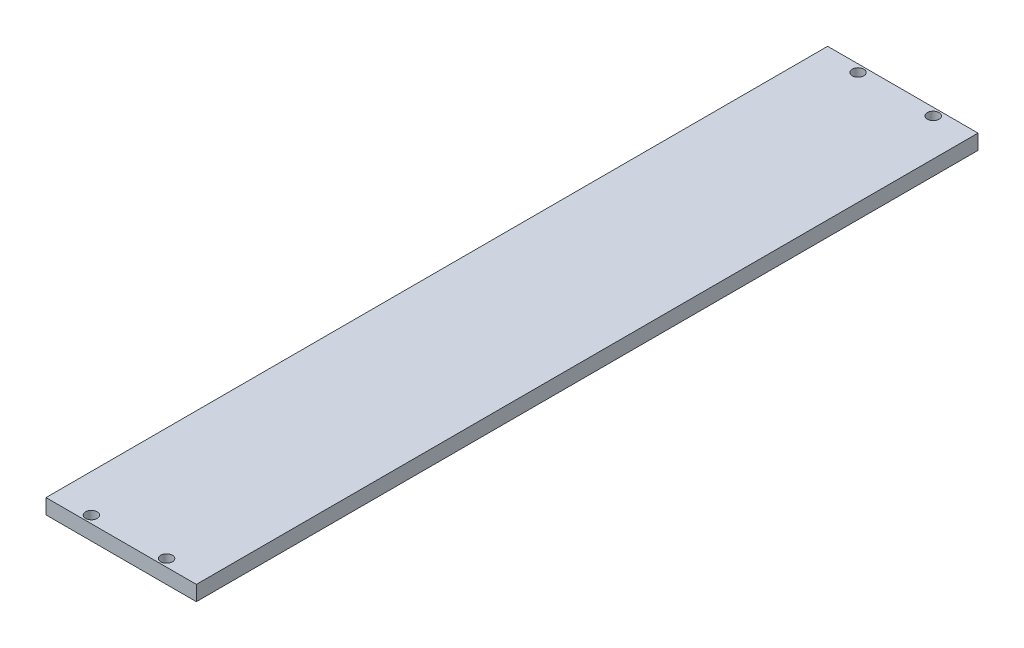
ISO-10303-21;
HEADER;
FILE_DESCRIPTION(('STEP AP214'),'2;1');
FILE_NAME('part.step','',(''),(''),'','','');
FILE_SCHEMA(('AUTOMOTIVE_DESIGN { 1 0 10303 214 1 1 1 1 }'));
ENDSEC;
DATA;
#1=APPLICATION_CONTEXT('core data for automotive mechanical design processes');
#2=APPLICATION_PROTOCOL_DEFINITION('international standard','automotive_design',2000,#1);
#3=PRODUCT_CONTEXT('',#1,'mechanical');
#4=PRODUCT('Part','Part','',(#3));
#5=PRODUCT_RELATED_PRODUCT_CATEGORY('part','',(#4));
#6=PRODUCT_DEFINITION_FORMATION('','',#4);
#7=PRODUCT_DEFINITION_CONTEXT('part definition',#1,'design');
#8=PRODUCT_DEFINITION('design','',#6,#7);
#9=PRODUCT_DEFINITION_SHAPE('','',#8);
#10=(LENGTH_UNIT() NAMED_UNIT(*) SI_UNIT(.MILLI.,.METRE.));
#11=(NAMED_UNIT(*) PLANE_ANGLE_UNIT() SI_UNIT($,.RADIAN.));
#12=(NAMED_UNIT(*) SI_UNIT($,.STERADIAN.) SOLID_ANGLE_UNIT());
#13=UNCERTAINTY_MEASURE_WITH_UNIT(LENGTH_MEASURE(1.E-05),#10,'distance_accuracy_value','');
#14=(GEOMETRIC_REPRESENTATION_CONTEXT(3) GLOBAL_UNCERTAINTY_ASSIGNED_CONTEXT((#13)) GLOBAL_UNIT_ASSIGNED_CONTEXT((#10,
#11,#12)) REPRESENTATION_CONTEXT('',''));
#15=CARTESIAN_POINT('',(0.,0.,0.));
#16=DIRECTION('',(0.,0.,1.));
#17=DIRECTION('',(1.,0.,0.));
#18=AXIS2_PLACEMENT_3D('',#15,#16,#17);
#19=CARTESIAN_POINT('',(-25.1507093147382,6.35,166.667524950475));
#20=DIRECTION('',(1.,0.,0.));
#21=DIRECTION('',(0.,0.,-1.));
#22=AXIS2_PLACEMENT_3D('',#19,#20,#21);
#23=PLANE('',#22);
#24=DIRECTION('',(0.,0.,1.));
#25=VECTOR('',#24,1.);
#26=CARTESIAN_POINT('',(-25.1507093147382,0.,166.667524950475));
#27=LINE('',#26,#25);
#28=CARTESIAN_POINT('',(-25.150709314738,0.,-163.482475049525));
#29=VERTEX_POINT('',#28);
#30=CARTESIAN_POINT('',(-25.1507093147382,0.,166.667524950475));
#31=VERTEX_POINT('',#30);
#32=EDGE_CURVE('E95',#29,#31,#27,.T.);
#33=ORIENTED_EDGE('',*,*,#32,.T.);
#34=DIRECTION('',(0.,-1.,0.));
#35=VECTOR('',#34,1.);
#36=CARTESIAN_POINT('',(-25.1507093147382,6.35,166.667524950475));
#37=LINE('',#36,#35);
#38=CARTESIAN_POINT('',(-25.1507093147382,6.35,166.667524950475));
#39=VERTEX_POINT('',#38);
#40=EDGE_CURVE('E11',#39,#31,#37,.T.);
#41=ORIENTED_EDGE('',*,*,#40,.F.);
#42=DIRECTION('',(0.,0.,1.));
#43=VECTOR('',#42,1.);
#44=CARTESIAN_POINT('',(-25.1507093147382,6.35,166.667524950475));
#45=LINE('',#44,#43);
#46=CARTESIAN_POINT('',(-25.150709314738,6.35,-163.482475049525));
#47=VERTEX_POINT('',#46);
#48=EDGE_CURVE('E83',#47,#39,#45,.T.);
#49=ORIENTED_EDGE('',*,*,#48,.F.);
#50=DIRECTION('',(0.,-1.,0.));
#51=VECTOR('',#50,1.);
#52=CARTESIAN_POINT('',(-25.150709314738,6.35,-163.482475049525));
#53=LINE('',#52,#51);
#54=EDGE_CURVE('E91',#47,#29,#53,.T.);
#55=ORIENTED_EDGE('',*,*,#54,.T.);
#56=EDGE_LOOP('',(#33,#41,#49,#55));
#57=FACE_BOUND('',#56,.T.);
#58=ADVANCED_FACE('F32',(#57),#23,.F.);
#59=CARTESIAN_POINT('',(38.3492906852618,6.35,166.667524950475));
#60=DIRECTION('',(0.,0.,-1.));
#61=DIRECTION('',(-1.,0.,0.));
#62=AXIS2_PLACEMENT_3D('',#59,#60,#61);
#63=PLANE('',#62);
#64=DIRECTION('',(1.,0.,0.));
#65=VECTOR('',#64,1.);
#66=CARTESIAN_POINT('',(38.3492906852618,0.,166.667524950475));
#67=LINE('',#66,#65);
#68=CARTESIAN_POINT('',(38.3492906852618,0.,166.667524950475));
#69=VERTEX_POINT('',#68);
#70=EDGE_CURVE('E87',#31,#69,#67,.T.);
#71=ORIENTED_EDGE('',*,*,#70,.T.);
#72=DIRECTION('',(0.,-1.,0.));
#73=VECTOR('',#72,1.);
#74=CARTESIAN_POINT('',(38.3492906852618,6.35,166.667524950475));
#75=LINE('',#74,#73);
#76=CARTESIAN_POINT('',(38.3492906852618,6.35,166.667524950475));
#77=VERTEX_POINT('',#76);
#78=EDGE_CURVE('E40',#77,#69,#75,.T.);
#79=ORIENTED_EDGE('',*,*,#78,.F.);
#80=DIRECTION('',(1.,0.,0.));
#81=VECTOR('',#80,1.);
#82=CARTESIAN_POINT('',(38.3492906852618,6.35,166.667524950475));
#83=LINE('',#82,#81);
#84=EDGE_CURVE('E78',#39,#77,#83,.T.);
#85=ORIENTED_EDGE('',*,*,#84,.F.);
#86=ORIENTED_EDGE('',*,*,#40,.T.);
#87=EDGE_LOOP('',(#71,#79,#85,#86));
#88=FACE_BOUND('',#87,.T.);
#89=ADVANCED_FACE('F86',(#88),#63,.F.);
#90=CARTESIAN_POINT('',(38.349290685262,6.35,-163.482475049525));
#91=DIRECTION('',(-1.,0.,0.));
#92=DIRECTION('',(0.,0.,1.));
#93=AXIS2_PLACEMENT_3D('',#90,#91,#92);
#94=PLANE('',#93);
#95=DIRECTION('',(0.,0.,-1.));
#96=VECTOR('',#95,1.);
#97=CARTESIAN_POINT('',(38.349290685262,0.,-163.482475049525));
#98=LINE('',#97,#96);
#99=CARTESIAN_POINT('',(38.349290685262,0.,-163.482475049525));
#100=VERTEX_POINT('',#99);
#101=EDGE_CURVE('E65',#69,#100,#98,.T.);
#102=ORIENTED_EDGE('',*,*,#101,.T.);
#103=DIRECTION('',(0.,-1.,0.));
#104=VECTOR('',#103,1.);
#105=CARTESIAN_POINT('',(38.349290685262,6.35,-163.482475049525));
#106=LINE('',#105,#104);
#107=CARTESIAN_POINT('',(38.349290685262,6.35,-163.482475049525));
#108=VERTEX_POINT('',#107);
#109=EDGE_CURVE('E88',#108,#100,#106,.T.);
#110=ORIENTED_EDGE('',*,*,#109,.F.);
#111=DIRECTION('',(0.,0.,-1.));
#112=VECTOR('',#111,1.);
#113=CARTESIAN_POINT('',(38.349290685262,6.35,-163.482475049525));
#114=LINE('',#113,#112);
#115=EDGE_CURVE('E81',#77,#108,#114,.T.);
#116=ORIENTED_EDGE('',*,*,#115,.F.);
#117=ORIENTED_EDGE('',*,*,#78,.T.);
#118=EDGE_LOOP('',(#102,#110,#116,#117));
#119=FACE_BOUND('',#118,.T.);
#120=ADVANCED_FACE('F89',(#119),#94,.F.);
#121=CARTESIAN_POINT('',(-25.150709314738,6.35,-163.482475049525));
#122=DIRECTION('',(0.,0.,1.));
#123=DIRECTION('',(1.,0.,0.));
#124=AXIS2_PLACEMENT_3D('',#121,#122,#123);
#125=PLANE('',#124);
#126=DIRECTION('',(-1.,0.,0.));
#127=VECTOR('',#126,1.);
#128=CARTESIAN_POINT('',(-25.150709314738,0.,-163.482475049525));
#129=LINE('',#128,#127);
#130=EDGE_CURVE('E71',#100,#29,#129,.T.);
#131=ORIENTED_EDGE('',*,*,#130,.T.);
#132=ORIENTED_EDGE('',*,*,#54,.F.);
#133=DIRECTION('',(-1.,0.,0.));
#134=VECTOR('',#133,1.);
#135=CARTESIAN_POINT('',(-25.150709314738,6.35,-163.482475049525));
#136=LINE('',#135,#134);
#137=EDGE_CURVE('E48',#108,#47,#136,.T.);
#138=ORIENTED_EDGE('',*,*,#137,.F.);
#139=ORIENTED_EDGE('',*,*,#109,.T.);
#140=EDGE_LOOP('',(#131,#132,#138,#139));
#141=FACE_BOUND('',#140,.T.);
#142=ADVANCED_FACE('F103',(#141),#125,.F.);
#143=CARTESIAN_POINT('',(-25.150709314738,6.35,-163.482475049525));
#144=DIRECTION('',(0.,-1.,0.));
#145=DIRECTION('',(0.,0.,-1.));
#146=AXIS2_PLACEMENT_3D('',#143,#144,#145);
#147=PLANE('',#146);
#148=CARTESIAN_POINT('',(22.601290685262,6.35,-160.307475049525));
#149=DIRECTION('',(0.,1.,0.));
#150=DIRECTION('',(0.,0.,1.));
#151=AXIS2_PLACEMENT_3D('',#148,#149,#150);
#152=CIRCLE('',#151,2.45744999999999);
#153=CARTESIAN_POINT('',(22.601290685262,6.35,-157.850025049525));
#154=VERTEX_POINT('',#153);
#155=EDGE_CURVE('E129',#154,#154,#152,.T.);
#156=ORIENTED_EDGE('',*,*,#155,.F.);
#157=EDGE_LOOP('',(#156));
#158=FACE_BOUND('',#157,.T.);
#159=CARTESIAN_POINT('',(-9.14870931473801,6.35,-160.307475049525));
#160=DIRECTION('',(0.,1.,0.));
#161=DIRECTION('',(0.,0.,1.));
#162=AXIS2_PLACEMENT_3D('',#159,#160,#161);
#163=CIRCLE('',#162,2.45744999999999);
#164=CARTESIAN_POINT('',(-9.14870931473801,6.35,-157.850025049525));
#165=VERTEX_POINT('',#164);
#166=EDGE_CURVE('E123',#165,#165,#163,.T.);
#167=ORIENTED_EDGE('',*,*,#166,.F.);
#168=EDGE_LOOP('',(#167));
#169=FACE_BOUND('',#168,.T.);
#170=CARTESIAN_POINT('',(-9.14870931473801,6.35,163.492524950475));
#171=DIRECTION('',(0.,1.,0.));
#172=DIRECTION('',(0.,0.,1.));
#173=AXIS2_PLACEMENT_3D('',#170,#171,#172);
#174=CIRCLE('',#173,2.45744999999999);
#175=CARTESIAN_POINT('',(-9.14870931473801,6.35,165.949974950475));
#176=VERTEX_POINT('',#175);
#177=EDGE_CURVE('E117',#176,#176,#174,.T.);
#178=ORIENTED_EDGE('',*,*,#177,.F.);
#179=EDGE_LOOP('',(#178));
#180=FACE_BOUND('',#179,.T.);
#181=CARTESIAN_POINT('',(22.601290685262,6.35,163.492524950475));
#182=DIRECTION('',(0.,1.,0.));
#183=DIRECTION('',(0.,0.,1.));
#184=AXIS2_PLACEMENT_3D('',#181,#182,#183);
#185=CIRCLE('',#184,2.45744999999999);
#186=CARTESIAN_POINT('',(22.601290685262,6.35,165.949974950475));
#187=VERTEX_POINT('',#186);
#188=EDGE_CURVE('E111',#187,#187,#185,.T.);
#189=ORIENTED_EDGE('',*,*,#188,.F.);
#190=EDGE_LOOP('',(#189));
#191=FACE_BOUND('',#190,.T.);
#192=ORIENTED_EDGE('',*,*,#48,.T.);
#193=ORIENTED_EDGE('',*,*,#84,.T.);
#194=ORIENTED_EDGE('',*,*,#115,.T.);
#195=ORIENTED_EDGE('',*,*,#137,.T.);
#196=EDGE_LOOP('',(#192,#193,#194,#195));
#197=FACE_BOUND('',#196,.T.);
#198=ADVANCED_FACE('F79',(#158,#169,#180,#191,#197),#147,.F.);
#199=CARTESIAN_POINT('',(-25.150709314738,0.,-163.482475049525));
#200=DIRECTION('',(0.,-1.,0.));
#201=DIRECTION('',(0.,0.,-1.));
#202=AXIS2_PLACEMENT_3D('',#199,#200,#201);
#203=PLANE('',#202);
#204=CARTESIAN_POINT('',(22.601290685262,0.,-160.307475049525));
#205=DIRECTION('',(0.,-1.,0.));
#206=DIRECTION('',(0.,0.,-1.));
#207=AXIS2_PLACEMENT_3D('',#204,#205,#206);
#208=CIRCLE('',#207,2.45744999999999);
#209=CARTESIAN_POINT('',(22.601290685262,0.,-162.764925049525));
#210=VERTEX_POINT('',#209);
#211=EDGE_CURVE('E126',#210,#210,#208,.T.);
#212=ORIENTED_EDGE('',*,*,#211,.F.);
#213=EDGE_LOOP('',(#212));
#214=FACE_BOUND('',#213,.T.);
#215=CARTESIAN_POINT('',(-9.14870931473801,0.,-160.307475049525));
#216=DIRECTION('',(0.,-1.,0.));
#217=DIRECTION('',(0.,0.,-1.));
#218=AXIS2_PLACEMENT_3D('',#215,#216,#217);
#219=CIRCLE('',#218,2.45744999999999);
#220=CARTESIAN_POINT('',(-9.14870931473801,0.,-162.764925049525));
#221=VERTEX_POINT('',#220);
#222=EDGE_CURVE('E120',#221,#221,#219,.T.);
#223=ORIENTED_EDGE('',*,*,#222,.F.);
#224=EDGE_LOOP('',(#223));
#225=FACE_BOUND('',#224,.T.);
#226=CARTESIAN_POINT('',(-9.14870931473801,0.,163.492524950475));
#227=DIRECTION('',(0.,-1.,0.));
#228=DIRECTION('',(0.,0.,-1.));
#229=AXIS2_PLACEMENT_3D('',#226,#227,#228);
#230=CIRCLE('',#229,2.45744999999999);
#231=CARTESIAN_POINT('',(-9.14870931473801,0.,161.035074950475));
#232=VERTEX_POINT('',#231);
#233=EDGE_CURVE('E114',#232,#232,#230,.T.);
#234=ORIENTED_EDGE('',*,*,#233,.F.);
#235=EDGE_LOOP('',(#234));
#236=FACE_BOUND('',#235,.T.);
#237=CARTESIAN_POINT('',(22.601290685262,0.,163.492524950475));
#238=DIRECTION('',(0.,-1.,0.));
#239=DIRECTION('',(0.,0.,-1.));
#240=AXIS2_PLACEMENT_3D('',#237,#238,#239);
#241=CIRCLE('',#240,2.45744999999999);
#242=CARTESIAN_POINT('',(22.601290685262,0.,161.035074950475));
#243=VERTEX_POINT('',#242);
#244=EDGE_CURVE('E98',#243,#243,#241,.T.);
#245=ORIENTED_EDGE('',*,*,#244,.F.);
#246=EDGE_LOOP('',(#245));
#247=FACE_BOUND('',#246,.T.);
#248=ORIENTED_EDGE('',*,*,#32,.F.);
#249=ORIENTED_EDGE('',*,*,#130,.F.);
#250=ORIENTED_EDGE('',*,*,#101,.F.);
#251=ORIENTED_EDGE('',*,*,#70,.F.);
#252=EDGE_LOOP('',(#248,#249,#250,#251));
#253=FACE_BOUND('',#252,.T.);
#254=ADVANCED_FACE('F106',(#214,#225,#236,#247,#253),#203,.T.);
#255=CARTESIAN_POINT('',(22.601290685262,6.35,163.492524950475));
#256=DIRECTION('',(0.,1.,0.));
#257=DIRECTION('',(0.,0.,1.));
#258=AXIS2_PLACEMENT_3D('',#255,#256,#257);
#259=CYLINDRICAL_SURFACE('',#258,2.45744999999999);
#260=ORIENTED_EDGE('',*,*,#244,.T.);
#261=EDGE_LOOP('',(#260));
#262=FACE_BOUND('',#261,.T.);
#263=ORIENTED_EDGE('',*,*,#188,.T.);
#264=EDGE_LOOP('',(#263));
#265=FACE_BOUND('',#264,.T.);
#266=ADVANCED_FACE('F144',(#262,#265),#259,.F.);
#267=CARTESIAN_POINT('',(-9.14870931473801,6.35,163.492524950475));
#268=DIRECTION('',(0.,1.,0.));
#269=DIRECTION('',(0.,0.,1.));
#270=AXIS2_PLACEMENT_3D('',#267,#268,#269);
#271=CYLINDRICAL_SURFACE('',#270,2.45744999999999);
#272=ORIENTED_EDGE('',*,*,#233,.T.);
#273=EDGE_LOOP('',(#272));
#274=FACE_BOUND('',#273,.T.);
#275=ORIENTED_EDGE('',*,*,#177,.T.);
#276=EDGE_LOOP('',(#275));
#277=FACE_BOUND('',#276,.T.);
#278=ADVANCED_FACE('F146',(#274,#277),#271,.F.);
#279=CARTESIAN_POINT('',(-9.14870931473801,6.35,-160.307475049525));
#280=DIRECTION('',(0.,1.,0.));
#281=DIRECTION('',(0.,0.,1.));
#282=AXIS2_PLACEMENT_3D('',#279,#280,#281);
#283=CYLINDRICAL_SURFACE('',#282,2.45744999999999);
#284=ORIENTED_EDGE('',*,*,#222,.T.);
#285=EDGE_LOOP('',(#284));
#286=FACE_BOUND('',#285,.T.);
#287=ORIENTED_EDGE('',*,*,#166,.T.);
#288=EDGE_LOOP('',(#287));
#289=FACE_BOUND('',#288,.T.);
#290=ADVANCED_FACE('F153',(#286,#289),#283,.F.);
#291=CARTESIAN_POINT('',(22.601290685262,6.35,-160.307475049525));
#292=DIRECTION('',(0.,1.,0.));
#293=DIRECTION('',(0.,0.,1.));
#294=AXIS2_PLACEMENT_3D('',#291,#292,#293);
#295=CYLINDRICAL_SURFACE('',#294,2.45744999999999);
#296=ORIENTED_EDGE('',*,*,#211,.T.);
#297=EDGE_LOOP('',(#296));
#298=FACE_BOUND('',#297,.T.);
#299=ORIENTED_EDGE('',*,*,#155,.T.);
#300=EDGE_LOOP('',(#299));
#301=FACE_BOUND('',#300,.T.);
#302=ADVANCED_FACE('F133',(#298,#301),#295,.F.);
#303=CLOSED_SHELL('',(#58,#89,#120,#142,#198,#254,#266,#278,#290,#302));
#304=MANIFOLD_SOLID_BREP('B2',#303);
#305=ADVANCED_BREP_SHAPE_REPRESENTATION('',(#18,#304),#14);
#306=SHAPE_DEFINITION_REPRESENTATION(#9,#305);
ENDSEC;
END-ISO-10303-21;
